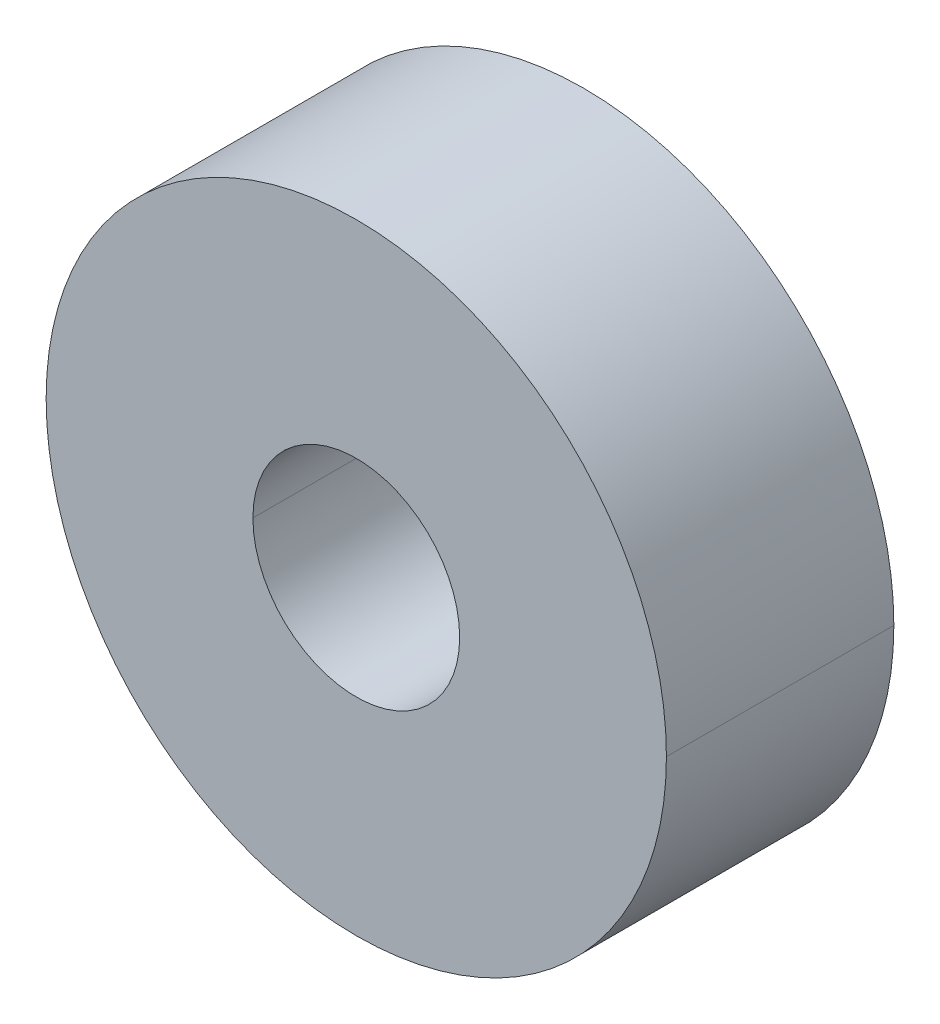
ISO-10303-21;
HEADER;
FILE_DESCRIPTION(('STEP AP214'),'2;1');
FILE_NAME('part.step','',(''),(''),'','','');
FILE_SCHEMA(('AUTOMOTIVE_DESIGN { 1 0 10303 214 1 1 1 1 }'));
ENDSEC;
DATA;
#1=APPLICATION_CONTEXT('core data for automotive mechanical design processes');
#2=APPLICATION_PROTOCOL_DEFINITION('international standard','automotive_design',2000,#1);
#3=PRODUCT_CONTEXT('',#1,'mechanical');
#4=PRODUCT('Part','Part','',(#3));
#5=PRODUCT_RELATED_PRODUCT_CATEGORY('part','',(#4));
#6=PRODUCT_DEFINITION_FORMATION('','',#4);
#7=PRODUCT_DEFINITION_CONTEXT('part definition',#1,'design');
#8=PRODUCT_DEFINITION('design','',#6,#7);
#9=PRODUCT_DEFINITION_SHAPE('','',#8);
#10=(LENGTH_UNIT() NAMED_UNIT(*) SI_UNIT(.MILLI.,.METRE.));
#11=(NAMED_UNIT(*) PLANE_ANGLE_UNIT() SI_UNIT($,.RADIAN.));
#12=(NAMED_UNIT(*) SI_UNIT($,.STERADIAN.) SOLID_ANGLE_UNIT());
#13=UNCERTAINTY_MEASURE_WITH_UNIT(LENGTH_MEASURE(1.E-05),#10,'distance_accuracy_value','');
#14=(GEOMETRIC_REPRESENTATION_CONTEXT(3) GLOBAL_UNCERTAINTY_ASSIGNED_CONTEXT((#13)) GLOBAL_UNIT_ASSIGNED_CONTEXT((#10,
#11,#12)) REPRESENTATION_CONTEXT('',''));
#15=CARTESIAN_POINT('',(0.,0.,0.));
#16=DIRECTION('',(0.,0.,1.));
#17=DIRECTION('',(1.,0.,0.));
#18=AXIS2_PLACEMENT_3D('',#15,#16,#17);
#19=CARTESIAN_POINT('',(0.,0.,11.));
#20=DIRECTION('',(0.,0.,-1.));
#21=DIRECTION('',(-1.,0.,0.));
#22=AXIS2_PLACEMENT_3D('',#19,#20,#21);
#23=CYLINDRICAL_SURFACE('',#22,5.);
#24=CARTESIAN_POINT('',(0.,0.,11.));
#25=DIRECTION('',(0.,0.,1.));
#26=DIRECTION('',(1.,0.,0.));
#27=AXIS2_PLACEMENT_3D('',#24,#25,#26);
#28=CIRCLE('',#27,5.);
#29=CARTESIAN_POINT('',(-5.,0.,11.));
#30=VERTEX_POINT('',#29);
#31=CARTESIAN_POINT('',(5.,0.,11.));
#32=VERTEX_POINT('',#31);
#33=EDGE_CURVE('E11',#30,#32,#28,.T.);
#34=ORIENTED_EDGE('',*,*,#33,.T.);
#35=DIRECTION('',(0.,0.,-1.));
#36=VECTOR('',#35,1.);
#37=CARTESIAN_POINT('',(5.,0.,11.));
#38=LINE('',#37,#36);
#39=CARTESIAN_POINT('',(5.,0.,0.));
#40=VERTEX_POINT('',#39);
#41=EDGE_CURVE('E28',#32,#40,#38,.T.);
#42=ORIENTED_EDGE('',*,*,#41,.T.);
#43=CARTESIAN_POINT('',(0.,0.,0.));
#44=DIRECTION('',(0.,0.,1.));
#45=DIRECTION('',(1.,0.,0.));
#46=AXIS2_PLACEMENT_3D('',#43,#44,#45);
#47=CIRCLE('',#46,5.);
#48=CARTESIAN_POINT('',(-5.,0.,0.));
#49=VERTEX_POINT('',#48);
#50=EDGE_CURVE('E88',#49,#40,#47,.T.);
#51=ORIENTED_EDGE('',*,*,#50,.F.);
#52=DIRECTION('',(0.,0.,-1.));
#53=VECTOR('',#52,1.);
#54=CARTESIAN_POINT('',(-5.,0.,11.));
#55=LINE('',#54,#53);
#56=EDGE_CURVE('E104',#30,#49,#55,.T.);
#57=ORIENTED_EDGE('',*,*,#56,.F.);
#58=EDGE_LOOP('',(#34,#42,#51,#57));
#59=FACE_BOUND('',#58,.T.);
#60=ADVANCED_FACE('F17',(#59),#23,.F.);
#61=CARTESIAN_POINT('',(0.,0.,11.));
#62=DIRECTION('',(0.,0.,-1.));
#63=DIRECTION('',(-1.,0.,0.));
#64=AXIS2_PLACEMENT_3D('',#61,#62,#63);
#65=CYLINDRICAL_SURFACE('',#64,15.);
#66=CARTESIAN_POINT('',(0.,0.,11.));
#67=DIRECTION('',(0.,0.,1.));
#68=DIRECTION('',(1.,0.,0.));
#69=AXIS2_PLACEMENT_3D('',#66,#67,#68);
#70=CIRCLE('',#69,15.);
#71=CARTESIAN_POINT('',(15.,0.,11.));
#72=VERTEX_POINT('',#71);
#73=CARTESIAN_POINT('',(-15.,0.,11.));
#74=VERTEX_POINT('',#73);
#75=EDGE_CURVE('E72',#72,#74,#70,.T.);
#76=ORIENTED_EDGE('',*,*,#75,.F.);
#77=DIRECTION('',(0.,0.,-1.));
#78=VECTOR('',#77,1.);
#79=CARTESIAN_POINT('',(15.,0.,11.));
#80=LINE('',#79,#78);
#81=CARTESIAN_POINT('',(15.,0.,0.));
#82=VERTEX_POINT('',#81);
#83=EDGE_CURVE('E91',#72,#82,#80,.T.);
#84=ORIENTED_EDGE('',*,*,#83,.T.);
#85=CARTESIAN_POINT('',(0.,0.,0.));
#86=DIRECTION('',(0.,0.,1.));
#87=DIRECTION('',(1.,0.,0.));
#88=AXIS2_PLACEMENT_3D('',#85,#86,#87);
#89=CIRCLE('',#88,15.);
#90=CARTESIAN_POINT('',(-15.,0.,0.));
#91=VERTEX_POINT('',#90);
#92=EDGE_CURVE('E21',#82,#91,#89,.T.);
#93=ORIENTED_EDGE('',*,*,#92,.T.);
#94=DIRECTION('',(0.,0.,-1.));
#95=VECTOR('',#94,1.);
#96=CARTESIAN_POINT('',(-15.,0.,11.));
#97=LINE('',#96,#95);
#98=EDGE_CURVE('E69',#74,#91,#97,.T.);
#99=ORIENTED_EDGE('',*,*,#98,.F.);
#100=EDGE_LOOP('',(#76,#84,#93,#99));
#101=FACE_BOUND('',#100,.T.);
#102=ADVANCED_FACE('F19',(#101),#65,.T.);
#103=CARTESIAN_POINT('',(0.,0.,11.));
#104=DIRECTION('',(0.,0.,1.));
#105=DIRECTION('',(1.,0.,0.));
#106=AXIS2_PLACEMENT_3D('',#103,#104,#105);
#107=PLANE('',#106);
#108=CARTESIAN_POINT('',(0.,0.,11.));
#109=DIRECTION('',(0.,0.,1.));
#110=DIRECTION('',(1.,0.,0.));
#111=AXIS2_PLACEMENT_3D('',#108,#109,#110);
#112=CIRCLE('',#111,15.);
#113=EDGE_CURVE('E86',#74,#72,#112,.T.);
#114=ORIENTED_EDGE('',*,*,#113,.T.);
#115=ORIENTED_EDGE('',*,*,#75,.T.);
#116=EDGE_LOOP('',(#114,#115));
#117=FACE_BOUND('',#116,.T.);
#118=ORIENTED_EDGE('',*,*,#33,.F.);
#119=CARTESIAN_POINT('',(0.,0.,11.));
#120=DIRECTION('',(0.,0.,1.));
#121=DIRECTION('',(1.,0.,0.));
#122=AXIS2_PLACEMENT_3D('',#119,#120,#121);
#123=CIRCLE('',#122,5.);
#124=EDGE_CURVE('E100',#32,#30,#123,.T.);
#125=ORIENTED_EDGE('',*,*,#124,.F.);
#126=EDGE_LOOP('',(#118,#125));
#127=FACE_BOUND('',#126,.T.);
#128=ADVANCED_FACE('F84',(#117,#127),#107,.T.);
#129=CARTESIAN_POINT('',(0.,0.,0.));
#130=DIRECTION('',(0.,0.,1.));
#131=DIRECTION('',(1.,0.,0.));
#132=AXIS2_PLACEMENT_3D('',#129,#130,#131);
#133=PLANE('',#132);
#134=CARTESIAN_POINT('',(0.,0.,0.));
#135=DIRECTION('',(0.,0.,1.));
#136=DIRECTION('',(1.,0.,0.));
#137=AXIS2_PLACEMENT_3D('',#134,#135,#136);
#138=CIRCLE('',#137,15.);
#139=EDGE_CURVE('E80',#91,#82,#138,.T.);
#140=ORIENTED_EDGE('',*,*,#139,.F.);
#141=ORIENTED_EDGE('',*,*,#92,.F.);
#142=EDGE_LOOP('',(#140,#141));
#143=FACE_BOUND('',#142,.T.);
#144=ORIENTED_EDGE('',*,*,#50,.T.);
#145=CARTESIAN_POINT('',(0.,0.,0.));
#146=DIRECTION('',(0.,0.,1.));
#147=DIRECTION('',(1.,0.,0.));
#148=AXIS2_PLACEMENT_3D('',#145,#146,#147);
#149=CIRCLE('',#148,5.);
#150=EDGE_CURVE('E79',#40,#49,#149,.T.);
#151=ORIENTED_EDGE('',*,*,#150,.T.);
#152=EDGE_LOOP('',(#144,#151));
#153=FACE_BOUND('',#152,.T.);
#154=ADVANCED_FACE('F118',(#143,#153),#133,.F.);
#155=CARTESIAN_POINT('',(0.,0.,11.));
#156=DIRECTION('',(0.,0.,-1.));
#157=DIRECTION('',(-1.,0.,0.));
#158=AXIS2_PLACEMENT_3D('',#155,#156,#157);
#159=CYLINDRICAL_SURFACE('',#158,15.);
#160=ORIENTED_EDGE('',*,*,#83,.F.);
#161=ORIENTED_EDGE('',*,*,#113,.F.);
#162=ORIENTED_EDGE('',*,*,#98,.T.);
#163=ORIENTED_EDGE('',*,*,#139,.T.);
#164=EDGE_LOOP('',(#160,#161,#162,#163));
#165=FACE_BOUND('',#164,.T.);
#166=ADVANCED_FACE('F90',(#165),#159,.T.);
#167=CARTESIAN_POINT('',(0.,0.,11.));
#168=DIRECTION('',(0.,0.,-1.));
#169=DIRECTION('',(-1.,0.,0.));
#170=AXIS2_PLACEMENT_3D('',#167,#168,#169);
#171=CYLINDRICAL_SURFACE('',#170,5.);
#172=ORIENTED_EDGE('',*,*,#41,.F.);
#173=ORIENTED_EDGE('',*,*,#124,.T.);
#174=ORIENTED_EDGE('',*,*,#56,.T.);
#175=ORIENTED_EDGE('',*,*,#150,.F.);
#176=EDGE_LOOP('',(#172,#173,#174,#175));
#177=FACE_BOUND('',#176,.T.);
#178=ADVANCED_FACE('F122',(#177),#171,.F.);
#179=CLOSED_SHELL('',(#60,#102,#128,#154,#166,#178));
#180=MANIFOLD_SOLID_BREP('B1',#179);
#181=ADVANCED_BREP_SHAPE_REPRESENTATION('',(#18,#180),#14);
#182=SHAPE_DEFINITION_REPRESENTATION(#9,#181);
ENDSEC;
END-ISO-10303-21;
